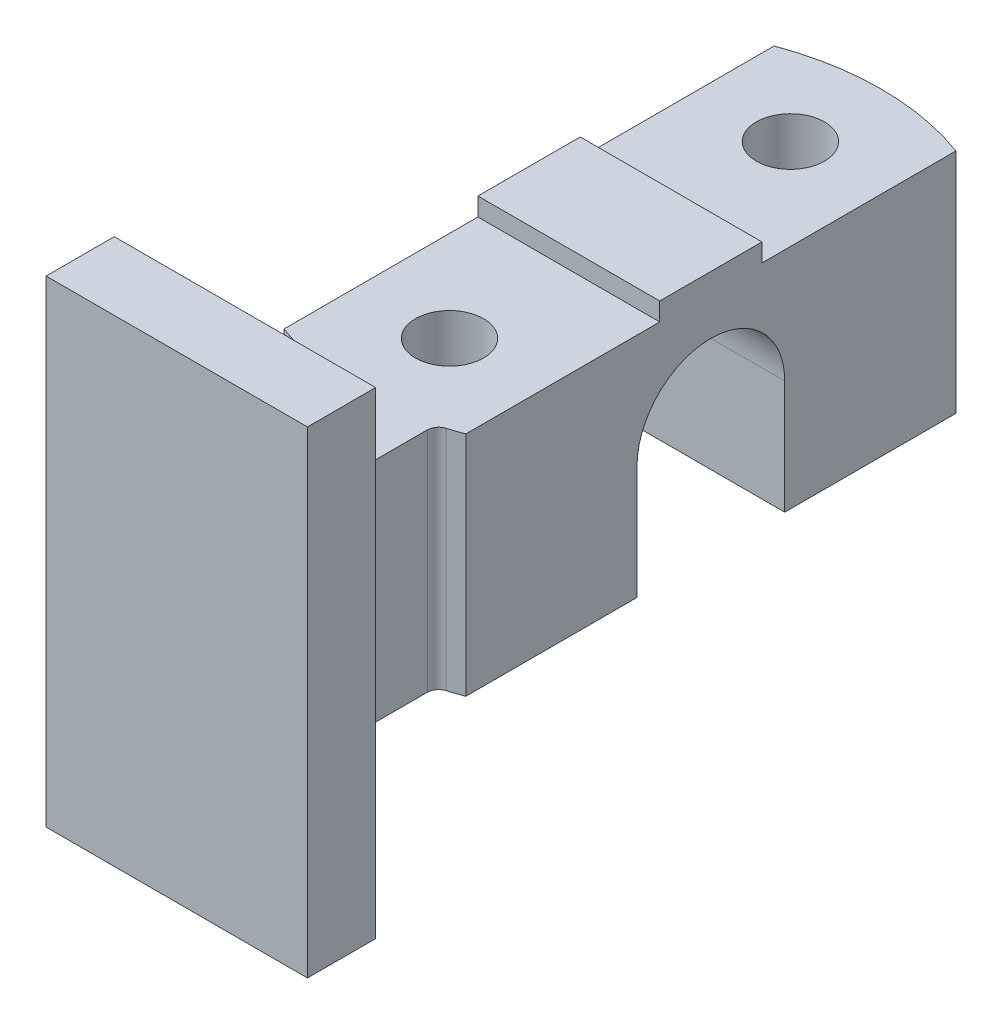
ISO-10303-21;
HEADER;
FILE_DESCRIPTION(('STEP AP214'),'2;1');
FILE_NAME('part.step','',(''),(''),'','','');
FILE_SCHEMA(('AUTOMOTIVE_DESIGN { 1 0 10303 214 1 1 1 1 }'));
ENDSEC;
DATA;
#1=APPLICATION_CONTEXT('core data for automotive mechanical design processes');
#2=APPLICATION_PROTOCOL_DEFINITION('international standard','automotive_design',2000,#1);
#3=PRODUCT_CONTEXT('',#1,'mechanical');
#4=PRODUCT('Part','Part','',(#3));
#5=PRODUCT_RELATED_PRODUCT_CATEGORY('part','',(#4));
#6=PRODUCT_DEFINITION_FORMATION('','',#4);
#7=PRODUCT_DEFINITION_CONTEXT('part definition',#1,'design');
#8=PRODUCT_DEFINITION('design','',#6,#7);
#9=PRODUCT_DEFINITION_SHAPE('','',#8);
#10=(LENGTH_UNIT() NAMED_UNIT(*) SI_UNIT(.MILLI.,.METRE.));
#11=(NAMED_UNIT(*) PLANE_ANGLE_UNIT() SI_UNIT($,.RADIAN.));
#12=(NAMED_UNIT(*) SI_UNIT($,.STERADIAN.) SOLID_ANGLE_UNIT());
#13=UNCERTAINTY_MEASURE_WITH_UNIT(LENGTH_MEASURE(1.E-05),#10,'distance_accuracy_value','');
#14=(GEOMETRIC_REPRESENTATION_CONTEXT(3) GLOBAL_UNCERTAINTY_ASSIGNED_CONTEXT((#13)) GLOBAL_UNIT_ASSIGNED_CONTEXT((#10,
#11,#12)) REPRESENTATION_CONTEXT('',''));
#15=CARTESIAN_POINT('',(0.,0.,0.));
#16=DIRECTION('',(0.,0.,1.));
#17=DIRECTION('',(1.,0.,0.));
#18=AXIS2_PLACEMENT_3D('',#15,#16,#17);
#19=CARTESIAN_POINT('',(0.,-50.,0.));
#20=DIRECTION('',(0.,1.,0.));
#21=DIRECTION('',(0.,0.,1.));
#22=AXIS2_PLACEMENT_3D('',#19,#20,#21);
#23=PLANE('',#22);
#24=CARTESIAN_POINT('',(0.,-50.,75.));
#25=DIRECTION('',(0.,1.,0.));
#26=DIRECTION('',(0.,0.,1.));
#27=AXIS2_PLACEMENT_3D('',#24,#25,#26);
#28=CIRCLE('',#27,15.);
#29=CARTESIAN_POINT('',(0.,-50.,90.));
#30=VERTEX_POINT('',#29);
#31=EDGE_CURVE('E325',#30,#30,#28,.T.);
#32=ORIENTED_EDGE('',*,*,#31,.T.);
#33=EDGE_LOOP('',(#32));
#34=FACE_BOUND('',#33,.T.);
#35=DIRECTION('',(0.,0.,-1.));
#36=VECTOR('',#35,1.);
#37=CARTESIAN_POINT('',(30.,-50.,0.));
#38=LINE('',#37,#36);
#39=CARTESIAN_POINT('',(30.,-50.,145.));
#40=VERTEX_POINT('',#39);
#41=CARTESIAN_POINT('',(30.,-50.,114.78240283249));
#42=VERTEX_POINT('',#41);
#43=EDGE_CURVE('E328',#40,#42,#38,.T.);
#44=ORIENTED_EDGE('',*,*,#43,.F.);
#45=DIRECTION('',(1.,0.,0.));
#46=VECTOR('',#45,1.);
#47=CARTESIAN_POINT('',(0.,-50.,145.));
#48=LINE('',#47,#46);
#49=CARTESIAN_POINT('',(-30.,-50.,145.));
#50=VERTEX_POINT('',#49);
#51=EDGE_CURVE('E383',#40,#50,#48,.F.);
#52=ORIENTED_EDGE('',*,*,#51,.T.);
#53=DIRECTION('',(0.,0.,-1.));
#54=VECTOR('',#53,1.);
#55=CARTESIAN_POINT('',(-30.,-50.,0.));
#56=LINE('',#55,#54);
#57=CARTESIAN_POINT('',(-30.,-50.,114.78240283249));
#58=VERTEX_POINT('',#57);
#59=EDGE_CURVE('E295',#50,#58,#56,.T.);
#60=ORIENTED_EDGE('',*,*,#59,.T.);
#61=CARTESIAN_POINT('',(-35.,-50.,114.78240283249));
#62=DIRECTION('',(0.,1.,0.));
#63=DIRECTION('',(0.,0.,1.));
#64=AXIS2_PLACEMENT_3D('',#61,#62,#63);
#65=CIRCLE('',#64,5.);
#66=CARTESIAN_POINT('',(-33.5416666666666,-50.,109.99980271447));
#67=VERTEX_POINT('',#66);
#68=EDGE_CURVE('E346',#58,#67,#65,.T.);
#69=ORIENTED_EDGE('',*,*,#68,.T.);
#70=CARTESIAN_POINT('',(0.,-50.,0.));
#71=DIRECTION('',(0.,1.,0.));
#72=DIRECTION('',(0.,0.,1.));
#73=AXIS2_PLACEMENT_3D('',#70,#71,#72);
#74=CIRCLE('',#73,115.);
#75=CARTESIAN_POINT('',(-40.,-50.,107.819293264239));
#76=VERTEX_POINT('',#75);
#77=EDGE_CURVE('E343',#76,#67,#74,.T.);
#78=ORIENTED_EDGE('',*,*,#77,.F.);
#79=DIRECTION('',(0.,0.,1.));
#80=VECTOR('',#79,1.);
#81=CARTESIAN_POINT('',(-40.,-50.,0.));
#82=LINE('',#81,#80);
#83=CARTESIAN_POINT('',(-40.,-50.,32.5));
#84=VERTEX_POINT('',#83);
#85=EDGE_CURVE('E341',#84,#76,#82,.T.);
#86=ORIENTED_EDGE('',*,*,#85,.F.);
#87=DIRECTION('',(-1.,0.,0.));
#88=VECTOR('',#87,1.);
#89=CARTESIAN_POINT('',(57.5000000000001,-50.,32.5));
#90=LINE('',#89,#88);
#91=CARTESIAN_POINT('',(40.,-50.,32.5));
#92=VERTEX_POINT('',#91);
#93=EDGE_CURVE('E228',#92,#84,#90,.T.);
#94=ORIENTED_EDGE('',*,*,#93,.F.);
#95=DIRECTION('',(0.,0.,1.));
#96=VECTOR('',#95,1.);
#97=CARTESIAN_POINT('',(40.,-50.,0.));
#98=LINE('',#97,#96);
#99=CARTESIAN_POINT('',(40.,-50.,107.819293264239));
#100=VERTEX_POINT('',#99);
#101=EDGE_CURVE('E335',#92,#100,#98,.T.);
#102=ORIENTED_EDGE('',*,*,#101,.T.);
#103=CARTESIAN_POINT('',(0.,-50.,0.));
#104=DIRECTION('',(0.,1.,0.));
#105=DIRECTION('',(0.,0.,1.));
#106=AXIS2_PLACEMENT_3D('',#103,#104,#105);
#107=CIRCLE('',#106,115.);
#108=CARTESIAN_POINT('',(33.5416666666666,-50.,109.99980271447));
#109=VERTEX_POINT('',#108);
#110=EDGE_CURVE('E332',#109,#100,#107,.T.);
#111=ORIENTED_EDGE('',*,*,#110,.F.);
#112=CARTESIAN_POINT('',(35.,-50.,114.78240283249));
#113=DIRECTION('',(0.,1.,0.));
#114=DIRECTION('',(0.,0.,1.));
#115=AXIS2_PLACEMENT_3D('',#112,#113,#114);
#116=CIRCLE('',#115,5.);
#117=EDGE_CURVE('E330',#42,#109,#116,.F.);
#118=ORIENTED_EDGE('',*,*,#117,.F.);
#119=EDGE_LOOP('',(#44,#52,#60,#69,#78,#86,#94,#102,#111,#118));
#120=FACE_BOUND('',#119,.T.);
#121=ADVANCED_FACE('F37',(#34,#120),#23,.F.);
#122=CARTESIAN_POINT('',(0.,50.,0.));
#123=DIRECTION('',(0.,1.,0.));
#124=DIRECTION('',(0.,0.,1.));
#125=AXIS2_PLACEMENT_3D('',#122,#123,#124);
#126=PLANE('',#125);
#127=CARTESIAN_POINT('',(0.,50.,75.));
#128=DIRECTION('',(0.,1.,0.));
#129=DIRECTION('',(0.,0.,1.));
#130=AXIS2_PLACEMENT_3D('',#127,#128,#129);
#131=CIRCLE('',#130,15.);
#132=CARTESIAN_POINT('',(0.,50.,90.));
#133=VERTEX_POINT('',#132);
#134=EDGE_CURVE('E294',#133,#133,#131,.T.);
#135=ORIENTED_EDGE('',*,*,#134,.F.);
#136=EDGE_LOOP('',(#135));
#137=FACE_BOUND('',#136,.T.);
#138=DIRECTION('',(0.,0.,-1.));
#139=VECTOR('',#138,1.);
#140=CARTESIAN_POINT('',(-30.,50.,0.));
#141=LINE('',#140,#139);
#142=CARTESIAN_POINT('',(-30.,50.,145.));
#143=VERTEX_POINT('',#142);
#144=CARTESIAN_POINT('',(-30.,50.,114.78240283249));
#145=VERTEX_POINT('',#144);
#146=EDGE_CURVE('E320',#143,#145,#141,.T.);
#147=ORIENTED_EDGE('',*,*,#146,.F.);
#148=DIRECTION('',(1.,0.,0.));
#149=VECTOR('',#148,1.);
#150=CARTESIAN_POINT('',(50.,50.,145.));
#151=LINE('',#150,#149);
#152=CARTESIAN_POINT('',(30.,50.,145.));
#153=VERTEX_POINT('',#152);
#154=EDGE_CURVE('E385',#143,#153,#151,.T.);
#155=ORIENTED_EDGE('',*,*,#154,.T.);
#156=DIRECTION('',(0.,0.,-1.));
#157=VECTOR('',#156,1.);
#158=CARTESIAN_POINT('',(30.,50.,0.));
#159=LINE('',#158,#157);
#160=CARTESIAN_POINT('',(30.,50.,114.78240283249));
#161=VERTEX_POINT('',#160);
#162=EDGE_CURVE('E298',#153,#161,#159,.T.);
#163=ORIENTED_EDGE('',*,*,#162,.T.);
#164=CARTESIAN_POINT('',(35.,50.,114.78240283249));
#165=DIRECTION('',(0.,1.,0.));
#166=DIRECTION('',(0.,0.,1.));
#167=AXIS2_PLACEMENT_3D('',#164,#165,#166);
#168=CIRCLE('',#167,5.);
#169=CARTESIAN_POINT('',(33.5416666666666,50.,109.99980271447));
#170=VERTEX_POINT('',#169);
#171=EDGE_CURVE('E300',#161,#170,#168,.F.);
#172=ORIENTED_EDGE('',*,*,#171,.T.);
#173=CARTESIAN_POINT('',(0.,50.,0.));
#174=DIRECTION('',(0.,1.,0.));
#175=DIRECTION('',(0.,0.,1.));
#176=AXIS2_PLACEMENT_3D('',#173,#174,#175);
#177=CIRCLE('',#176,115.);
#178=CARTESIAN_POINT('',(40.,50.,107.819293264239));
#179=VERTEX_POINT('',#178);
#180=EDGE_CURVE('E302',#170,#179,#177,.T.);
#181=ORIENTED_EDGE('',*,*,#180,.T.);
#182=DIRECTION('',(0.,0.,1.));
#183=VECTOR('',#182,1.);
#184=CARTESIAN_POINT('',(40.,50.,0.));
#185=LINE('',#184,#183);
#186=CARTESIAN_POINT('',(40.,50.,22.5));
#187=VERTEX_POINT('',#186);
#188=EDGE_CURVE('E305',#187,#179,#185,.T.);
#189=ORIENTED_EDGE('',*,*,#188,.F.);
#190=DIRECTION('',(1.,0.,0.));
#191=VECTOR('',#190,1.);
#192=CARTESIAN_POINT('',(-40.,50.,22.5));
#193=LINE('',#192,#191);
#194=CARTESIAN_POINT('',(-40.,50.,22.5));
#195=VERTEX_POINT('',#194);
#196=EDGE_CURVE('E236',#195,#187,#193,.T.);
#197=ORIENTED_EDGE('',*,*,#196,.F.);
#198=DIRECTION('',(0.,0.,1.));
#199=VECTOR('',#198,1.);
#200=CARTESIAN_POINT('',(-40.,50.,0.));
#201=LINE('',#200,#199);
#202=CARTESIAN_POINT('',(-40.,50.,107.819293264239));
#203=VERTEX_POINT('',#202);
#204=EDGE_CURVE('E311',#195,#203,#201,.T.);
#205=ORIENTED_EDGE('',*,*,#204,.T.);
#206=CARTESIAN_POINT('',(0.,50.,0.));
#207=DIRECTION('',(0.,1.,0.));
#208=DIRECTION('',(0.,0.,1.));
#209=AXIS2_PLACEMENT_3D('',#206,#207,#208);
#210=CIRCLE('',#209,115.);
#211=CARTESIAN_POINT('',(-33.5416666666666,50.,109.99980271447));
#212=VERTEX_POINT('',#211);
#213=EDGE_CURVE('E315',#203,#212,#210,.T.);
#214=ORIENTED_EDGE('',*,*,#213,.T.);
#215=CARTESIAN_POINT('',(-35.,50.,114.78240283249));
#216=DIRECTION('',(0.,1.,0.));
#217=DIRECTION('',(0.,0.,1.));
#218=AXIS2_PLACEMENT_3D('',#215,#216,#217);
#219=CIRCLE('',#218,5.);
#220=EDGE_CURVE('E317',#145,#212,#219,.T.);
#221=ORIENTED_EDGE('',*,*,#220,.F.);
#222=EDGE_LOOP('',(#147,#155,#163,#172,#181,#189,#197,#205,#214,#221));
#223=FACE_BOUND('',#222,.T.);
#224=ADVANCED_FACE('F423',(#137,#223),#126,.T.);
#225=CARTESIAN_POINT('',(0.,50.,-75.));
#226=DIRECTION('',(0.,1.,0.));
#227=DIRECTION('',(0.,0.,1.));
#228=AXIS2_PLACEMENT_3D('',#225,#226,#227);
#229=CIRCLE('',#228,15.);
#230=CARTESIAN_POINT('',(0.,50.,-60.));
#231=VERTEX_POINT('',#230);
#232=EDGE_CURVE('E291',#231,#231,#229,.T.);
#233=ORIENTED_EDGE('',*,*,#232,.F.);
#234=EDGE_LOOP('',(#233));
#235=FACE_BOUND('',#234,.T.);
#236=CARTESIAN_POINT('',(-40.,50.,-107.819293264239));
#237=VERTEX_POINT('',#236);
#238=CARTESIAN_POINT('',(-40.,50.,-22.5));
#239=VERTEX_POINT('',#238);
#240=EDGE_CURVE('E312',#237,#239,#201,.T.);
#241=ORIENTED_EDGE('',*,*,#240,.T.);
#242=DIRECTION('',(-1.,0.,0.));
#243=VECTOR('',#242,1.);
#244=CARTESIAN_POINT('',(-40.,50.,-22.5));
#245=LINE('',#244,#243);
#246=CARTESIAN_POINT('',(40.,50.,-22.5));
#247=VERTEX_POINT('',#246);
#248=EDGE_CURVE('E241',#247,#239,#245,.T.);
#249=ORIENTED_EDGE('',*,*,#248,.F.);
#250=CARTESIAN_POINT('',(40.,50.,-107.819293264239));
#251=VERTEX_POINT('',#250);
#252=EDGE_CURVE('E306',#251,#247,#185,.T.);
#253=ORIENTED_EDGE('',*,*,#252,.F.);
#254=CARTESIAN_POINT('',(0.,50.,0.));
#255=DIRECTION('',(0.,1.,0.));
#256=DIRECTION('',(0.,0.,1.));
#257=AXIS2_PLACEMENT_3D('',#254,#255,#256);
#258=CIRCLE('',#257,115.);
#259=EDGE_CURVE('E309',#251,#237,#258,.T.);
#260=ORIENTED_EDGE('',*,*,#259,.T.);
#261=EDGE_LOOP('',(#241,#249,#253,#260));
#262=FACE_BOUND('',#261,.T.);
#263=ADVANCED_FACE('F456',(#235,#262),#126,.T.);
#264=CARTESIAN_POINT('',(50.,50.,145.));
#265=DIRECTION('',(0.,-1.,0.));
#266=DIRECTION('',(0.,0.,-1.));
#267=AXIS2_PLACEMENT_3D('',#264,#265,#266);
#268=CYLINDRICAL_SURFACE('',#267,20.);
#269=DIRECTION('',(0.,-1.,0.));
#270=VECTOR('',#269,1.);
#271=CARTESIAN_POINT('',(50.,50.,165.));
#272=LINE('',#271,#270);
#273=CARTESIAN_POINT('',(50.,70.,165.));
#274=VERTEX_POINT('',#273);
#275=CARTESIAN_POINT('',(50.,-70.,165.));
#276=VERTEX_POINT('',#275);
#277=EDGE_CURVE('E52',#274,#276,#272,.T.);
#278=ORIENTED_EDGE('',*,*,#277,.T.);
#279=CARTESIAN_POINT('',(50.,-70.,145.));
#280=DIRECTION('',(-0.707106781186547,-0.707106781186547,0.));
#281=DIRECTION('',(0.707106781186547,-0.707106781186547,0.));
#282=AXIS2_PLACEMENT_3D('',#279,#280,#281);
#283=ELLIPSE('',#282,28.2842712474619,20.);
#284=EDGE_CURVE('E388',#276,#40,#283,.T.);
#285=ORIENTED_EDGE('',*,*,#284,.T.);
#286=DIRECTION('',(0.,-1.,0.));
#287=VECTOR('',#286,1.);
#288=CARTESIAN_POINT('',(30.,50.,145.));
#289=LINE('',#288,#287);
#290=EDGE_CURVE('E375',#153,#40,#289,.T.);
#291=ORIENTED_EDGE('',*,*,#290,.F.);
#292=CARTESIAN_POINT('',(50.,70.,145.));
#293=DIRECTION('',(0.707106781186547,-0.707106781186547,0.));
#294=DIRECTION('',(-0.707106781186547,-0.707106781186547,0.));
#295=AXIS2_PLACEMENT_3D('',#292,#293,#294);
#296=ELLIPSE('',#295,28.2842712474619,20.);
#297=EDGE_CURVE('E45',#153,#274,#296,.F.);
#298=ORIENTED_EDGE('',*,*,#297,.T.);
#299=EDGE_LOOP('',(#278,#285,#291,#298));
#300=FACE_BOUND('',#299,.T.);
#301=ADVANCED_FACE('F393',(#300),#268,.F.);
#302=CARTESIAN_POINT('',(30.,50.,0.));
#303=DIRECTION('',(-1.,0.,0.));
#304=DIRECTION('',(0.,0.,1.));
#305=AXIS2_PLACEMENT_3D('',#302,#303,#304);
#306=PLANE('',#305);
#307=ORIENTED_EDGE('',*,*,#43,.T.);
#308=DIRECTION('',(0.,-1.,0.));
#309=VECTOR('',#308,1.);
#310=CARTESIAN_POINT('',(30.,50.,114.78240283249));
#311=LINE('',#310,#309);
#312=EDGE_CURVE('E372',#161,#42,#311,.T.);
#313=ORIENTED_EDGE('',*,*,#312,.F.);
#314=ORIENTED_EDGE('',*,*,#162,.F.);
#315=ORIENTED_EDGE('',*,*,#290,.T.);
#316=EDGE_LOOP('',(#307,#313,#314,#315));
#317=FACE_BOUND('',#316,.T.);
#318=ADVANCED_FACE('F407',(#317),#306,.F.);
#319=CARTESIAN_POINT('',(35.,50.,114.78240283249));
#320=DIRECTION('',(0.,-1.,0.));
#321=DIRECTION('',(0.,0.,-1.));
#322=AXIS2_PLACEMENT_3D('',#319,#320,#321);
#323=CYLINDRICAL_SURFACE('',#322,5.);
#324=ORIENTED_EDGE('',*,*,#117,.T.);
#325=DIRECTION('',(0.,-1.,0.));
#326=VECTOR('',#325,1.);
#327=CARTESIAN_POINT('',(33.5416666666666,50.,109.99980271447));
#328=LINE('',#327,#326);
#329=EDGE_CURVE('E369',#170,#109,#328,.T.);
#330=ORIENTED_EDGE('',*,*,#329,.F.);
#331=ORIENTED_EDGE('',*,*,#171,.F.);
#332=ORIENTED_EDGE('',*,*,#312,.T.);
#333=EDGE_LOOP('',(#324,#330,#331,#332));
#334=FACE_BOUND('',#333,.T.);
#335=ADVANCED_FACE('F414',(#334),#323,.F.);
#336=CARTESIAN_POINT('',(0.,50.,0.));
#337=DIRECTION('',(0.,-1.,0.));
#338=DIRECTION('',(0.,0.,-1.));
#339=AXIS2_PLACEMENT_3D('',#336,#337,#338);
#340=CYLINDRICAL_SURFACE('',#339,115.);
#341=ORIENTED_EDGE('',*,*,#110,.T.);
#342=DIRECTION('',(0.,-1.,0.));
#343=VECTOR('',#342,1.);
#344=CARTESIAN_POINT('',(40.,50.,107.819293264239));
#345=LINE('',#344,#343);
#346=EDGE_CURVE('E366',#179,#100,#345,.T.);
#347=ORIENTED_EDGE('',*,*,#346,.F.);
#348=ORIENTED_EDGE('',*,*,#180,.F.);
#349=ORIENTED_EDGE('',*,*,#329,.T.);
#350=EDGE_LOOP('',(#341,#347,#348,#349));
#351=FACE_BOUND('',#350,.T.);
#352=ADVANCED_FACE('F418',(#351),#340,.T.);
#353=CARTESIAN_POINT('',(40.,50.,0.));
#354=DIRECTION('',(1.,0.,0.));
#355=DIRECTION('',(0.,0.,-1.));
#356=AXIS2_PLACEMENT_3D('',#353,#354,#355);
#357=PLANE('',#356);
#358=DIRECTION('',(0.,-1.,0.));
#359=VECTOR('',#358,1.);
#360=CARTESIAN_POINT('',(40.,50.,32.5));
#361=LINE('',#360,#359);
#362=CARTESIAN_POINT('',(40.,0.,32.5));
#363=VERTEX_POINT('',#362);
#364=EDGE_CURVE('E232',#363,#92,#361,.T.);
#365=ORIENTED_EDGE('',*,*,#364,.F.);
#366=CARTESIAN_POINT('',(40.,0.,0.));
#367=DIRECTION('',(1.,0.,0.));
#368=DIRECTION('',(0.,0.,-1.));
#369=AXIS2_PLACEMENT_3D('',#366,#367,#368);
#370=CIRCLE('',#369,32.5);
#371=CARTESIAN_POINT('',(40.,0.,-32.5));
#372=VERTEX_POINT('',#371);
#373=EDGE_CURVE('E234',#372,#363,#370,.T.);
#374=ORIENTED_EDGE('',*,*,#373,.F.);
#375=DIRECTION('',(0.,1.,0.));
#376=VECTOR('',#375,1.);
#377=CARTESIAN_POINT('',(40.,50.,-32.5));
#378=LINE('',#377,#376);
#379=CARTESIAN_POINT('',(40.,-50.,-32.5));
#380=VERTEX_POINT('',#379);
#381=EDGE_CURVE('E204',#380,#372,#378,.T.);
#382=ORIENTED_EDGE('',*,*,#381,.F.);
#383=CARTESIAN_POINT('',(40.,-50.,-107.819293264239));
#384=VERTEX_POINT('',#383);
#385=EDGE_CURVE('E336',#384,#380,#98,.T.);
#386=ORIENTED_EDGE('',*,*,#385,.F.);
#387=DIRECTION('',(0.,-1.,0.));
#388=VECTOR('',#387,1.);
#389=CARTESIAN_POINT('',(40.,50.,-107.819293264239));
#390=LINE('',#389,#388);
#391=EDGE_CURVE('E364',#251,#384,#390,.T.);
#392=ORIENTED_EDGE('',*,*,#391,.F.);
#393=ORIENTED_EDGE('',*,*,#252,.T.);
#394=DIRECTION('',(0.,-1.,0.));
#395=VECTOR('',#394,1.);
#396=CARTESIAN_POINT('',(40.,58.,-22.5));
#397=LINE('',#396,#395);
#398=CARTESIAN_POINT('',(40.,58.,-22.5));
#399=VERTEX_POINT('',#398);
#400=EDGE_CURVE('E252',#399,#247,#397,.T.);
#401=ORIENTED_EDGE('',*,*,#400,.F.);
#402=DIRECTION('',(0.,0.,-1.));
#403=VECTOR('',#402,1.);
#404=CARTESIAN_POINT('',(40.,58.,-22.5));
#405=LINE('',#404,#403);
#406=CARTESIAN_POINT('',(40.,58.,22.5));
#407=VERTEX_POINT('',#406);
#408=EDGE_CURVE('E243',#407,#399,#405,.T.);
#409=ORIENTED_EDGE('',*,*,#408,.F.);
#410=DIRECTION('',(0.,-1.,0.));
#411=VECTOR('',#410,1.);
#412=CARTESIAN_POINT('',(40.,58.,22.5));
#413=LINE('',#412,#411);
#414=EDGE_CURVE('E254',#407,#187,#413,.T.);
#415=ORIENTED_EDGE('',*,*,#414,.T.);
#416=ORIENTED_EDGE('',*,*,#188,.T.);
#417=ORIENTED_EDGE('',*,*,#346,.T.);
#418=ORIENTED_EDGE('',*,*,#101,.F.);
#419=EDGE_LOOP('',(#365,#374,#382,#386,#392,#393,#401,#409,#415,#416,#417,#418));
#420=FACE_BOUND('',#419,.T.);
#421=ADVANCED_FACE('F507',(#420),#357,.T.);
#422=CARTESIAN_POINT('',(0.,50.,0.));
#423=DIRECTION('',(0.,-1.,0.));
#424=DIRECTION('',(0.,0.,-1.));
#425=AXIS2_PLACEMENT_3D('',#422,#423,#424);
#426=CYLINDRICAL_SURFACE('',#425,115.);
#427=CARTESIAN_POINT('',(0.,-50.,0.));
#428=DIRECTION('',(0.,1.,0.));
#429=DIRECTION('',(0.,0.,1.));
#430=AXIS2_PLACEMENT_3D('',#427,#428,#429);
#431=CIRCLE('',#430,115.);
#432=CARTESIAN_POINT('',(-40.,-50.,-107.819293264239));
#433=VERTEX_POINT('',#432);
#434=EDGE_CURVE('E339',#384,#433,#431,.T.);
#435=ORIENTED_EDGE('',*,*,#434,.T.);
#436=DIRECTION('',(0.,-1.,0.));
#437=VECTOR('',#436,1.);
#438=CARTESIAN_POINT('',(-40.,50.,-107.819293264239));
#439=LINE('',#438,#437);
#440=EDGE_CURVE('E362',#237,#433,#439,.T.);
#441=ORIENTED_EDGE('',*,*,#440,.F.);
#442=ORIENTED_EDGE('',*,*,#259,.F.);
#443=ORIENTED_EDGE('',*,*,#391,.T.);
#444=EDGE_LOOP('',(#435,#441,#442,#443));
#445=FACE_BOUND('',#444,.T.);
#446=ADVANCED_FACE('F531',(#445),#426,.T.);
#447=CARTESIAN_POINT('',(-40.,50.,0.));
#448=DIRECTION('',(1.,0.,0.));
#449=DIRECTION('',(0.,0.,-1.));
#450=AXIS2_PLACEMENT_3D('',#447,#448,#449);
#451=PLANE('',#450);
#452=CARTESIAN_POINT('',(-40.,0.,0.));
#453=DIRECTION('',(-1.,0.,0.));
#454=DIRECTION('',(0.,0.,1.));
#455=AXIS2_PLACEMENT_3D('',#452,#453,#454);
#456=CIRCLE('',#455,32.5);
#457=CARTESIAN_POINT('',(-40.,0.,32.5));
#458=VERTEX_POINT('',#457);
#459=CARTESIAN_POINT('',(-40.,0.,-32.5));
#460=VERTEX_POINT('',#459);
#461=EDGE_CURVE('E211',#458,#460,#456,.T.);
#462=ORIENTED_EDGE('',*,*,#461,.F.);
#463=DIRECTION('',(0.,1.,0.));
#464=VECTOR('',#463,1.);
#465=CARTESIAN_POINT('',(-40.,-50.,32.5));
#466=LINE('',#465,#464);
#467=EDGE_CURVE('E208',#84,#458,#466,.T.);
#468=ORIENTED_EDGE('',*,*,#467,.F.);
#469=ORIENTED_EDGE('',*,*,#85,.T.);
#470=DIRECTION('',(0.,-1.,0.));
#471=VECTOR('',#470,1.);
#472=CARTESIAN_POINT('',(-40.,50.,107.819293264239));
#473=LINE('',#472,#471);
#474=EDGE_CURVE('E359',#203,#76,#473,.T.);
#475=ORIENTED_EDGE('',*,*,#474,.F.);
#476=ORIENTED_EDGE('',*,*,#204,.F.);
#477=DIRECTION('',(0.,-1.,0.));
#478=VECTOR('',#477,1.);
#479=CARTESIAN_POINT('',(-40.,58.,22.5));
#480=LINE('',#479,#478);
#481=CARTESIAN_POINT('',(-40.,58.,22.5));
#482=VERTEX_POINT('',#481);
#483=EDGE_CURVE('E257',#482,#195,#480,.T.);
#484=ORIENTED_EDGE('',*,*,#483,.F.);
#485=DIRECTION('',(0.,0.,1.));
#486=VECTOR('',#485,1.);
#487=CARTESIAN_POINT('',(-40.,58.,-22.5));
#488=LINE('',#487,#486);
#489=CARTESIAN_POINT('',(-40.,58.,-22.5));
#490=VERTEX_POINT('',#489);
#491=EDGE_CURVE('E237',#490,#482,#488,.T.);
#492=ORIENTED_EDGE('',*,*,#491,.F.);
#493=DIRECTION('',(0.,-1.,0.));
#494=VECTOR('',#493,1.);
#495=CARTESIAN_POINT('',(-40.,58.,-22.5));
#496=LINE('',#495,#494);
#497=EDGE_CURVE('E247',#490,#239,#496,.T.);
#498=ORIENTED_EDGE('',*,*,#497,.T.);
#499=ORIENTED_EDGE('',*,*,#240,.F.);
#500=ORIENTED_EDGE('',*,*,#440,.T.);
#501=CARTESIAN_POINT('',(-40.,-50.,-32.5));
#502=VERTEX_POINT('',#501);
#503=EDGE_CURVE('E223',#433,#502,#82,.T.);
#504=ORIENTED_EDGE('',*,*,#503,.T.);
#505=DIRECTION('',(0.,-1.,0.));
#506=VECTOR('',#505,1.);
#507=CARTESIAN_POINT('',(-40.,0.,-32.5));
#508=LINE('',#507,#506);
#509=EDGE_CURVE('E201',#460,#502,#508,.T.);
#510=ORIENTED_EDGE('',*,*,#509,.F.);
#511=EDGE_LOOP('',(#462,#468,#469,#475,#476,#484,#492,#498,#499,#500,#504,#510));
#512=FACE_BOUND('',#511,.T.);
#513=ADVANCED_FACE('F220',(#512),#451,.F.);
#514=CARTESIAN_POINT('',(0.,50.,0.));
#515=DIRECTION('',(0.,-1.,0.));
#516=DIRECTION('',(0.,0.,-1.));
#517=AXIS2_PLACEMENT_3D('',#514,#515,#516);
#518=CYLINDRICAL_SURFACE('',#517,115.);
#519=ORIENTED_EDGE('',*,*,#77,.T.);
#520=DIRECTION('',(0.,-1.,0.));
#521=VECTOR('',#520,1.);
#522=CARTESIAN_POINT('',(-33.5416666666666,50.,109.99980271447));
#523=LINE('',#522,#521);
#524=EDGE_CURVE('E357',#212,#67,#523,.T.);
#525=ORIENTED_EDGE('',*,*,#524,.F.);
#526=ORIENTED_EDGE('',*,*,#213,.F.);
#527=ORIENTED_EDGE('',*,*,#474,.T.);
#528=EDGE_LOOP('',(#519,#525,#526,#527));
#529=FACE_BOUND('',#528,.T.);
#530=ADVANCED_FACE('F518',(#529),#518,.T.);
#531=CARTESIAN_POINT('',(-35.,50.,114.78240283249));
#532=DIRECTION('',(0.,-1.,0.));
#533=DIRECTION('',(0.,0.,-1.));
#534=AXIS2_PLACEMENT_3D('',#531,#532,#533);
#535=CYLINDRICAL_SURFACE('',#534,5.);
#536=ORIENTED_EDGE('',*,*,#68,.F.);
#537=DIRECTION('',(0.,-1.,0.));
#538=VECTOR('',#537,1.);
#539=CARTESIAN_POINT('',(-30.,50.,114.78240283249));
#540=LINE('',#539,#538);
#541=EDGE_CURVE('E355',#145,#58,#540,.T.);
#542=ORIENTED_EDGE('',*,*,#541,.F.);
#543=ORIENTED_EDGE('',*,*,#220,.T.);
#544=ORIENTED_EDGE('',*,*,#524,.T.);
#545=EDGE_LOOP('',(#536,#542,#543,#544));
#546=FACE_BOUND('',#545,.T.);
#547=ADVANCED_FACE('F520',(#546),#535,.F.);
#548=CARTESIAN_POINT('',(-30.,50.,0.));
#549=DIRECTION('',(-1.,0.,0.));
#550=DIRECTION('',(0.,0.,1.));
#551=AXIS2_PLACEMENT_3D('',#548,#549,#550);
#552=PLANE('',#551);
#553=ORIENTED_EDGE('',*,*,#59,.F.);
#554=DIRECTION('',(0.,-1.,0.));
#555=VECTOR('',#554,1.);
#556=CARTESIAN_POINT('',(-30.,50.,145.));
#557=LINE('',#556,#555);
#558=EDGE_CURVE('E352',#143,#50,#557,.T.);
#559=ORIENTED_EDGE('',*,*,#558,.F.);
#560=ORIENTED_EDGE('',*,*,#146,.T.);
#561=ORIENTED_EDGE('',*,*,#541,.T.);
#562=EDGE_LOOP('',(#553,#559,#560,#561));
#563=FACE_BOUND('',#562,.T.);
#564=ADVANCED_FACE('F429',(#563),#552,.T.);
#565=CARTESIAN_POINT('',(0.,50.,75.));
#566=DIRECTION('',(0.,-1.,0.));
#567=DIRECTION('',(0.,0.,-1.));
#568=AXIS2_PLACEMENT_3D('',#565,#566,#567);
#569=CYLINDRICAL_SURFACE('',#568,15.);
#570=ORIENTED_EDGE('',*,*,#134,.T.);
#571=EDGE_LOOP('',(#570));
#572=FACE_BOUND('',#571,.T.);
#573=ORIENTED_EDGE('',*,*,#31,.F.);
#574=EDGE_LOOP('',(#573));
#575=FACE_BOUND('',#574,.T.);
#576=ADVANCED_FACE('F446',(#572,#575),#569,.F.);
#577=CARTESIAN_POINT('',(0.,50.,-75.));
#578=DIRECTION('',(0.,-1.,0.));
#579=DIRECTION('',(0.,0.,-1.));
#580=AXIS2_PLACEMENT_3D('',#577,#578,#579);
#581=CYLINDRICAL_SURFACE('',#580,15.);
#582=ORIENTED_EDGE('',*,*,#232,.T.);
#583=EDGE_LOOP('',(#582));
#584=FACE_BOUND('',#583,.T.);
#585=CARTESIAN_POINT('',(0.,-50.,-75.));
#586=DIRECTION('',(0.,1.,0.));
#587=DIRECTION('',(0.,0.,1.));
#588=AXIS2_PLACEMENT_3D('',#585,#586,#587);
#589=CIRCLE('',#588,15.);
#590=CARTESIAN_POINT('',(0.,-50.,-60.));
#591=VERTEX_POINT('',#590);
#592=EDGE_CURVE('E290',#591,#591,#589,.T.);
#593=ORIENTED_EDGE('',*,*,#592,.F.);
#594=EDGE_LOOP('',(#593));
#595=FACE_BOUND('',#594,.T.);
#596=ADVANCED_FACE('F435',(#584,#595),#581,.F.);
#597=CARTESIAN_POINT('',(-50.,50.,145.));
#598=DIRECTION('',(0.,-1.,0.));
#599=DIRECTION('',(0.,0.,-1.));
#600=AXIS2_PLACEMENT_3D('',#597,#598,#599);
#601=CYLINDRICAL_SURFACE('',#600,20.);
#602=ORIENTED_EDGE('',*,*,#558,.T.);
#603=CARTESIAN_POINT('',(-50.,-70.,145.));
#604=DIRECTION('',(0.707106781186547,-0.707106781186547,0.));
#605=DIRECTION('',(0.707106781186547,0.707106781186547,0.));
#606=AXIS2_PLACEMENT_3D('',#603,#604,#605);
#607=ELLIPSE('',#606,28.2842712474619,20.);
#608=CARTESIAN_POINT('',(-49.9999999999999,-70.,165.));
#609=VERTEX_POINT('',#608);
#610=EDGE_CURVE('E390',#50,#609,#607,.T.);
#611=ORIENTED_EDGE('',*,*,#610,.T.);
#612=DIRECTION('',(0.,-1.,0.));
#613=VECTOR('',#612,1.);
#614=CARTESIAN_POINT('',(-49.9999999999999,50.,165.));
#615=LINE('',#614,#613);
#616=CARTESIAN_POINT('',(-49.9999999999999,70.,165.));
#617=VERTEX_POINT('',#616);
#618=EDGE_CURVE('E60',#617,#609,#615,.T.);
#619=ORIENTED_EDGE('',*,*,#618,.F.);
#620=CARTESIAN_POINT('',(-50.,70.,145.));
#621=DIRECTION('',(-0.707106781186547,-0.707106781186547,0.));
#622=DIRECTION('',(-0.707106781186547,0.707106781186547,0.));
#623=AXIS2_PLACEMENT_3D('',#620,#621,#622);
#624=ELLIPSE('',#623,28.2842712474619,20.);
#625=EDGE_CURVE('E11',#617,#143,#624,.F.);
#626=ORIENTED_EDGE('',*,*,#625,.T.);
#627=EDGE_LOOP('',(#602,#611,#619,#626));
#628=FACE_BOUND('',#627,.T.);
#629=ADVANCED_FACE('F432',(#628),#601,.F.);
#630=ORIENTED_EDGE('',*,*,#592,.T.);
#631=EDGE_LOOP('',(#630));
#632=FACE_BOUND('',#631,.T.);
#633=ORIENTED_EDGE('',*,*,#385,.T.);
#634=DIRECTION('',(-1.,0.,0.));
#635=VECTOR('',#634,1.);
#636=CARTESIAN_POINT('',(57.5,-50.,-32.5));
#637=LINE('',#636,#635);
#638=EDGE_CURVE('E207',#380,#502,#637,.T.);
#639=ORIENTED_EDGE('',*,*,#638,.T.);
#640=ORIENTED_EDGE('',*,*,#503,.F.);
#641=ORIENTED_EDGE('',*,*,#434,.F.);
#642=EDGE_LOOP('',(#633,#639,#640,#641));
#643=FACE_BOUND('',#642,.T.);
#644=ADVANCED_FACE('F434',(#632,#643),#23,.F.);
#645=CARTESIAN_POINT('',(0.,105.,195.));
#646=DIRECTION('',(0.,0.,-1.));
#647=DIRECTION('',(-1.,0.,0.));
#648=AXIS2_PLACEMENT_3D('',#645,#646,#647);
#649=PLANE('',#648);
#650=DIRECTION('',(1.,0.,0.));
#651=VECTOR('',#650,1.);
#652=CARTESIAN_POINT('',(0.,-105.,195.));
#653=LINE('',#652,#651);
#654=CARTESIAN_POINT('',(-57.5,-105.,195.));
#655=VERTEX_POINT('',#654);
#656=CARTESIAN_POINT('',(57.5,-105.,195.));
#657=VERTEX_POINT('',#656);
#658=EDGE_CURVE('E259',#655,#657,#653,.T.);
#659=ORIENTED_EDGE('',*,*,#658,.T.);
#660=DIRECTION('',(0.,-1.,0.));
#661=VECTOR('',#660,1.);
#662=CARTESIAN_POINT('',(57.5,105.,195.));
#663=LINE('',#662,#661);
#664=CARTESIAN_POINT('',(57.5,105.,195.));
#665=VERTEX_POINT('',#664);
#666=EDGE_CURVE('E287',#665,#657,#663,.T.);
#667=ORIENTED_EDGE('',*,*,#666,.F.);
#668=DIRECTION('',(1.,0.,0.));
#669=VECTOR('',#668,1.);
#670=CARTESIAN_POINT('',(0.,105.,195.));
#671=LINE('',#670,#669);
#672=CARTESIAN_POINT('',(-57.5,105.,195.));
#673=VERTEX_POINT('',#672);
#674=EDGE_CURVE('E260',#673,#665,#671,.T.);
#675=ORIENTED_EDGE('',*,*,#674,.F.);
#676=DIRECTION('',(0.,-1.,0.));
#677=VECTOR('',#676,1.);
#678=CARTESIAN_POINT('',(-57.5,105.,195.));
#679=LINE('',#678,#677);
#680=EDGE_CURVE('E271',#673,#655,#679,.T.);
#681=ORIENTED_EDGE('',*,*,#680,.T.);
#682=EDGE_LOOP('',(#659,#667,#675,#681));
#683=FACE_BOUND('',#682,.T.);
#684=ADVANCED_FACE('F442',(#683),#649,.F.);
#685=CARTESIAN_POINT('',(57.5,105.,0.));
#686=DIRECTION('',(-1.,0.,0.));
#687=DIRECTION('',(0.,0.,1.));
#688=AXIS2_PLACEMENT_3D('',#685,#686,#687);
#689=PLANE('',#688);
#690=DIRECTION('',(0.,0.,-1.));
#691=VECTOR('',#690,1.);
#692=CARTESIAN_POINT('',(57.5,-105.,0.));
#693=LINE('',#692,#691);
#694=CARTESIAN_POINT('',(57.5,-105.,165.));
#695=VERTEX_POINT('',#694);
#696=EDGE_CURVE('E274',#657,#695,#693,.T.);
#697=ORIENTED_EDGE('',*,*,#696,.T.);
#698=DIRECTION('',(0.,-1.,0.));
#699=VECTOR('',#698,1.);
#700=CARTESIAN_POINT('',(57.5,105.,165.));
#701=LINE('',#700,#699);
#702=CARTESIAN_POINT('',(57.5,105.,165.));
#703=VERTEX_POINT('',#702);
#704=EDGE_CURVE('E285',#703,#695,#701,.T.);
#705=ORIENTED_EDGE('',*,*,#704,.F.);
#706=DIRECTION('',(0.,0.,-1.));
#707=VECTOR('',#706,1.);
#708=CARTESIAN_POINT('',(57.5,105.,0.));
#709=LINE('',#708,#707);
#710=EDGE_CURVE('E263',#665,#703,#709,.T.);
#711=ORIENTED_EDGE('',*,*,#710,.F.);
#712=ORIENTED_EDGE('',*,*,#666,.T.);
#713=EDGE_LOOP('',(#697,#705,#711,#712));
#714=FACE_BOUND('',#713,.T.);
#715=ADVANCED_FACE('F462',(#714),#689,.F.);
#716=CARTESIAN_POINT('',(0.,105.,165.));
#717=DIRECTION('',(0.,0.,-1.));
#718=DIRECTION('',(-1.,0.,0.));
#719=AXIS2_PLACEMENT_3D('',#716,#717,#718);
#720=PLANE('',#719);
#721=DIRECTION('',(1.,0.,0.));
#722=VECTOR('',#721,1.);
#723=CARTESIAN_POINT('',(0.,-70.,165.));
#724=LINE('',#723,#722);
#725=EDGE_CURVE('E381',#609,#276,#724,.T.);
#726=ORIENTED_EDGE('',*,*,#725,.T.);
#727=ORIENTED_EDGE('',*,*,#277,.F.);
#728=DIRECTION('',(1.,0.,0.));
#729=VECTOR('',#728,1.);
#730=CARTESIAN_POINT('',(-49.9999999999999,70.,165.));
#731=LINE('',#730,#729);
#732=EDGE_CURVE('E379',#274,#617,#731,.F.);
#733=ORIENTED_EDGE('',*,*,#732,.T.);
#734=ORIENTED_EDGE('',*,*,#618,.T.);
#735=EDGE_LOOP('',(#726,#727,#733,#734));
#736=FACE_BOUND('',#735,.T.);
#737=DIRECTION('',(1.,0.,0.));
#738=VECTOR('',#737,1.);
#739=CARTESIAN_POINT('',(0.,-105.,165.));
#740=LINE('',#739,#738);
#741=CARTESIAN_POINT('',(-57.5,-105.,165.));
#742=VERTEX_POINT('',#741);
#743=EDGE_CURVE('E277',#742,#695,#740,.T.);
#744=ORIENTED_EDGE('',*,*,#743,.F.);
#745=DIRECTION('',(0.,-1.,0.));
#746=VECTOR('',#745,1.);
#747=CARTESIAN_POINT('',(-57.5,105.,165.));
#748=LINE('',#747,#746);
#749=CARTESIAN_POINT('',(-57.5,105.,165.));
#750=VERTEX_POINT('',#749);
#751=EDGE_CURVE('E283',#750,#742,#748,.T.);
#752=ORIENTED_EDGE('',*,*,#751,.F.);
#753=DIRECTION('',(1.,0.,0.));
#754=VECTOR('',#753,1.);
#755=CARTESIAN_POINT('',(0.,105.,165.));
#756=LINE('',#755,#754);
#757=EDGE_CURVE('E266',#750,#703,#756,.T.);
#758=ORIENTED_EDGE('',*,*,#757,.T.);
#759=ORIENTED_EDGE('',*,*,#704,.T.);
#760=EDGE_LOOP('',(#744,#752,#758,#759));
#761=FACE_BOUND('',#760,.T.);
#762=ADVANCED_FACE('F398',(#736,#761),#720,.T.);
#763=CARTESIAN_POINT('',(-57.5,105.,0.));
#764=DIRECTION('',(1.,0.,0.));
#765=DIRECTION('',(0.,0.,-1.));
#766=AXIS2_PLACEMENT_3D('',#763,#764,#765);
#767=PLANE('',#766);
#768=DIRECTION('',(0.,0.,1.));
#769=VECTOR('',#768,1.);
#770=CARTESIAN_POINT('',(-57.5,-105.,0.));
#771=LINE('',#770,#769);
#772=EDGE_CURVE('E264',#742,#655,#771,.T.);
#773=ORIENTED_EDGE('',*,*,#772,.T.);
#774=ORIENTED_EDGE('',*,*,#680,.F.);
#775=DIRECTION('',(0.,0.,1.));
#776=VECTOR('',#775,1.);
#777=CARTESIAN_POINT('',(-57.5,105.,0.));
#778=LINE('',#777,#776);
#779=EDGE_CURVE('E269',#750,#673,#778,.T.);
#780=ORIENTED_EDGE('',*,*,#779,.F.);
#781=ORIENTED_EDGE('',*,*,#751,.T.);
#782=EDGE_LOOP('',(#773,#774,#780,#781));
#783=FACE_BOUND('',#782,.T.);
#784=ADVANCED_FACE('F468',(#783),#767,.F.);
#785=CARTESIAN_POINT('',(0.,105.,0.));
#786=DIRECTION('',(0.,1.,0.));
#787=DIRECTION('',(0.,0.,1.));
#788=AXIS2_PLACEMENT_3D('',#785,#786,#787);
#789=PLANE('',#788);
#790=ORIENTED_EDGE('',*,*,#674,.T.);
#791=ORIENTED_EDGE('',*,*,#710,.T.);
#792=ORIENTED_EDGE('',*,*,#757,.F.);
#793=ORIENTED_EDGE('',*,*,#779,.T.);
#794=EDGE_LOOP('',(#790,#791,#792,#793));
#795=FACE_BOUND('',#794,.T.);
#796=ADVANCED_FACE('F471',(#795),#789,.T.);
#797=CARTESIAN_POINT('',(0.,-105.,0.));
#798=DIRECTION('',(0.,1.,0.));
#799=DIRECTION('',(0.,0.,1.));
#800=AXIS2_PLACEMENT_3D('',#797,#798,#799);
#801=PLANE('',#800);
#802=ORIENTED_EDGE('',*,*,#658,.F.);
#803=ORIENTED_EDGE('',*,*,#772,.F.);
#804=ORIENTED_EDGE('',*,*,#743,.T.);
#805=ORIENTED_EDGE('',*,*,#696,.F.);
#806=EDGE_LOOP('',(#802,#803,#804,#805));
#807=FACE_BOUND('',#806,.T.);
#808=ADVANCED_FACE('F473',(#807),#801,.F.);
#809=CARTESIAN_POINT('',(-40.,58.,22.5));
#810=DIRECTION('',(0.,0.,-1.));
#811=DIRECTION('',(-1.,0.,0.));
#812=AXIS2_PLACEMENT_3D('',#809,#810,#811);
#813=PLANE('',#812);
#814=ORIENTED_EDGE('',*,*,#196,.T.);
#815=ORIENTED_EDGE('',*,*,#414,.F.);
#816=DIRECTION('',(1.,0.,0.));
#817=VECTOR('',#816,1.);
#818=CARTESIAN_POINT('',(-40.,58.,22.5));
#819=LINE('',#818,#817);
#820=EDGE_CURVE('E240',#482,#407,#819,.T.);
#821=ORIENTED_EDGE('',*,*,#820,.F.);
#822=ORIENTED_EDGE('',*,*,#483,.T.);
#823=EDGE_LOOP('',(#814,#815,#821,#822));
#824=FACE_BOUND('',#823,.T.);
#825=ADVANCED_FACE('F476',(#824),#813,.F.);
#826=CARTESIAN_POINT('',(-40.,58.,-22.5));
#827=DIRECTION('',(0.,0.,1.));
#828=DIRECTION('',(1.,0.,0.));
#829=AXIS2_PLACEMENT_3D('',#826,#827,#828);
#830=PLANE('',#829);
#831=ORIENTED_EDGE('',*,*,#248,.T.);
#832=ORIENTED_EDGE('',*,*,#497,.F.);
#833=DIRECTION('',(-1.,0.,0.));
#834=VECTOR('',#833,1.);
#835=CARTESIAN_POINT('',(-40.,58.,-22.5));
#836=LINE('',#835,#834);
#837=EDGE_CURVE('E245',#399,#490,#836,.T.);
#838=ORIENTED_EDGE('',*,*,#837,.F.);
#839=ORIENTED_EDGE('',*,*,#400,.T.);
#840=EDGE_LOOP('',(#831,#832,#838,#839));
#841=FACE_BOUND('',#840,.T.);
#842=ADVANCED_FACE('F483',(#841),#830,.F.);
#843=CARTESIAN_POINT('',(0.,58.,0.));
#844=DIRECTION('',(0.,1.,0.));
#845=DIRECTION('',(0.,0.,1.));
#846=AXIS2_PLACEMENT_3D('',#843,#844,#845);
#847=PLANE('',#846);
#848=ORIENTED_EDGE('',*,*,#491,.T.);
#849=ORIENTED_EDGE('',*,*,#820,.T.);
#850=ORIENTED_EDGE('',*,*,#408,.T.);
#851=ORIENTED_EDGE('',*,*,#837,.T.);
#852=EDGE_LOOP('',(#848,#849,#850,#851));
#853=FACE_BOUND('',#852,.T.);
#854=ADVANCED_FACE('F487',(#853),#847,.T.);
#855=CARTESIAN_POINT('',(57.5000000000001,0.,0.));
#856=DIRECTION('',(-1.,0.,0.));
#857=DIRECTION('',(0.,0.,1.));
#858=AXIS2_PLACEMENT_3D('',#855,#856,#857);
#859=CYLINDRICAL_SURFACE('',#858,32.5);
#860=ORIENTED_EDGE('',*,*,#373,.T.);
#861=DIRECTION('',(-1.,0.,0.));
#862=VECTOR('',#861,1.);
#863=CARTESIAN_POINT('',(57.5000000000001,0.,32.5));
#864=LINE('',#863,#862);
#865=EDGE_CURVE('E214',#363,#458,#864,.T.);
#866=ORIENTED_EDGE('',*,*,#865,.T.);
#867=ORIENTED_EDGE('',*,*,#461,.T.);
#868=DIRECTION('',(-1.,0.,0.));
#869=VECTOR('',#868,1.);
#870=CARTESIAN_POINT('',(57.5,0.,-32.5));
#871=LINE('',#870,#869);
#872=EDGE_CURVE('E197',#372,#460,#871,.T.);
#873=ORIENTED_EDGE('',*,*,#872,.F.);
#874=EDGE_LOOP('',(#860,#866,#867,#873));
#875=FACE_BOUND('',#874,.T.);
#876=ADVANCED_FACE('F212',(#875),#859,.F.);
#877=CARTESIAN_POINT('',(57.5000000000001,-50.,32.5));
#878=DIRECTION('',(0.,0.,1.));
#879=DIRECTION('',(1.,0.,0.));
#880=AXIS2_PLACEMENT_3D('',#877,#878,#879);
#881=PLANE('',#880);
#882=ORIENTED_EDGE('',*,*,#364,.T.);
#883=ORIENTED_EDGE('',*,*,#93,.T.);
#884=ORIENTED_EDGE('',*,*,#467,.T.);
#885=ORIENTED_EDGE('',*,*,#865,.F.);
#886=EDGE_LOOP('',(#882,#883,#884,#885));
#887=FACE_BOUND('',#886,.T.);
#888=ADVANCED_FACE('F494',(#887),#881,.F.);
#889=CARTESIAN_POINT('',(57.5,0.,-32.5));
#890=DIRECTION('',(0.,0.,-1.));
#891=DIRECTION('',(-1.,0.,0.));
#892=AXIS2_PLACEMENT_3D('',#889,#890,#891);
#893=PLANE('',#892);
#894=ORIENTED_EDGE('',*,*,#381,.T.);
#895=ORIENTED_EDGE('',*,*,#872,.T.);
#896=ORIENTED_EDGE('',*,*,#509,.T.);
#897=ORIENTED_EDGE('',*,*,#638,.F.);
#898=EDGE_LOOP('',(#894,#895,#896,#897));
#899=FACE_BOUND('',#898,.T.);
#900=ADVANCED_FACE('F199',(#899),#893,.F.);
#901=CARTESIAN_POINT('',(0.,-70.,145.));
#902=DIRECTION('',(1.,0.,0.));
#903=DIRECTION('',(0.,0.,-1.));
#904=AXIS2_PLACEMENT_3D('',#901,#902,#903);
#905=CYLINDRICAL_SURFACE('',#904,20.);
#906=ORIENTED_EDGE('',*,*,#610,.F.);
#907=ORIENTED_EDGE('',*,*,#51,.F.);
#908=ORIENTED_EDGE('',*,*,#284,.F.);
#909=ORIENTED_EDGE('',*,*,#725,.F.);
#910=EDGE_LOOP('',(#906,#907,#908,#909));
#911=FACE_BOUND('',#910,.T.);
#912=ADVANCED_FACE('F403',(#911),#905,.F.);
#913=CARTESIAN_POINT('',(0.,70.,145.));
#914=DIRECTION('',(-1.,0.,0.));
#915=DIRECTION('',(0.,0.,1.));
#916=AXIS2_PLACEMENT_3D('',#913,#914,#915);
#917=CYLINDRICAL_SURFACE('',#916,20.);
#918=ORIENTED_EDGE('',*,*,#625,.F.);
#919=ORIENTED_EDGE('',*,*,#732,.F.);
#920=ORIENTED_EDGE('',*,*,#297,.F.);
#921=ORIENTED_EDGE('',*,*,#154,.F.);
#922=EDGE_LOOP('',(#918,#919,#920,#921));
#923=FACE_BOUND('',#922,.T.);
#924=ADVANCED_FACE('F39',(#923),#917,.F.);
#925=CLOSED_SHELL('',(#121,#224,#263,#301,#318,#335,#352,#421,#446,#513,#530,#547,#564,#576,
#596,#629,#644,#684,#715,#762,#784,#796,#808,#825,#842,#854,#876,#888,#900,#912,#924));
#926=MANIFOLD_SOLID_BREP('B2',#925);
#927=ADVANCED_BREP_SHAPE_REPRESENTATION('',(#18,#926),#14);
#928=SHAPE_DEFINITION_REPRESENTATION(#9,#927);
ENDSEC;
END-ISO-10303-21;
